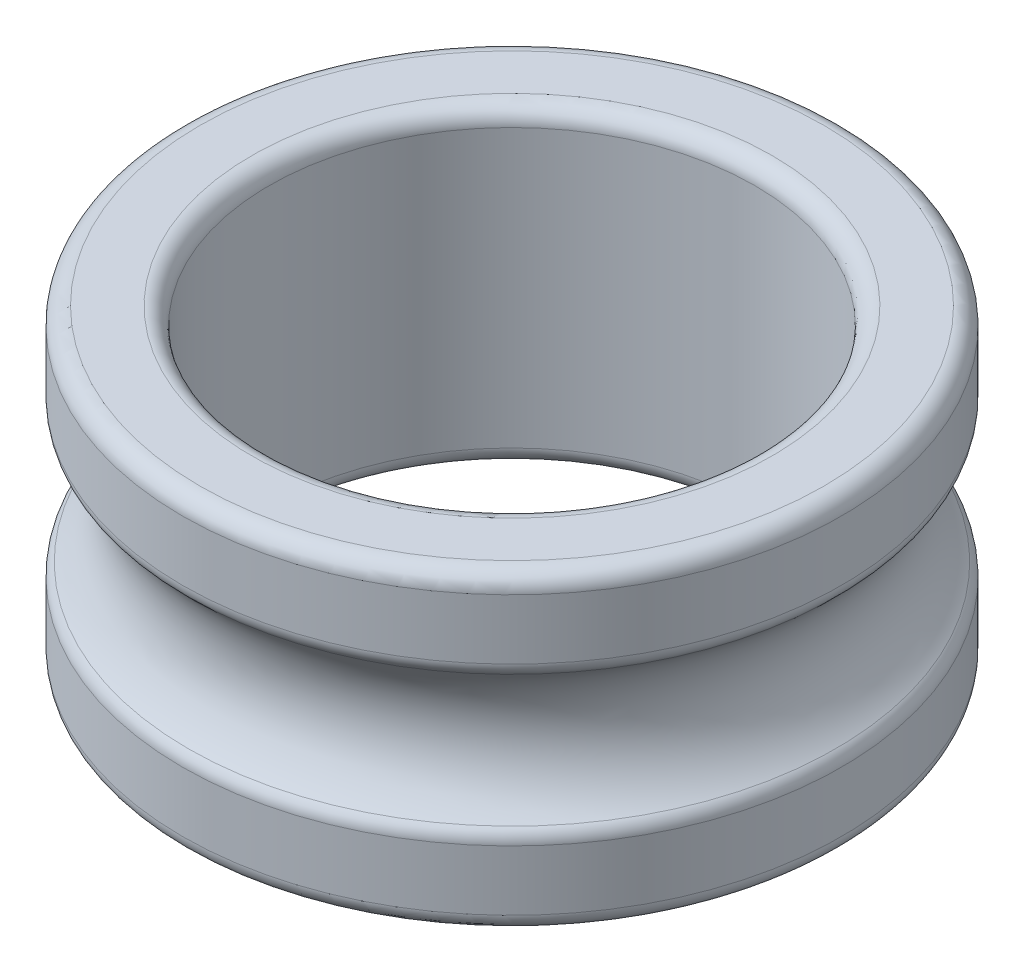
ISO-10303-21;
HEADER;
FILE_DESCRIPTION(('STEP AP214'),'2;1');
FILE_NAME('part.step','',(''),(''),'','','');
FILE_SCHEMA(('AUTOMOTIVE_DESIGN { 1 0 10303 214 1 1 1 1 }'));
ENDSEC;
DATA;
#1=APPLICATION_CONTEXT('core data for automotive mechanical design processes');
#2=APPLICATION_PROTOCOL_DEFINITION('international standard','automotive_design',2000,#1);
#3=PRODUCT_CONTEXT('',#1,'mechanical');
#4=PRODUCT('Part','Part','',(#3));
#5=PRODUCT_RELATED_PRODUCT_CATEGORY('part','',(#4));
#6=PRODUCT_DEFINITION_FORMATION('','',#4);
#7=PRODUCT_DEFINITION_CONTEXT('part definition',#1,'design');
#8=PRODUCT_DEFINITION('design','',#6,#7);
#9=PRODUCT_DEFINITION_SHAPE('','',#8);
#10=(LENGTH_UNIT() NAMED_UNIT(*) SI_UNIT(.MILLI.,.METRE.));
#11=(NAMED_UNIT(*) PLANE_ANGLE_UNIT() SI_UNIT($,.RADIAN.));
#12=(NAMED_UNIT(*) SI_UNIT($,.STERADIAN.) SOLID_ANGLE_UNIT());
#13=UNCERTAINTY_MEASURE_WITH_UNIT(LENGTH_MEASURE(1.E-05),#10,'distance_accuracy_value','');
#14=(GEOMETRIC_REPRESENTATION_CONTEXT(3) GLOBAL_UNCERTAINTY_ASSIGNED_CONTEXT((#13)) GLOBAL_UNIT_ASSIGNED_CONTEXT((#10,
#11,#12)) REPRESENTATION_CONTEXT('',''));
#15=CARTESIAN_POINT('',(0.,0.,0.));
#16=DIRECTION('',(0.,0.,1.));
#17=DIRECTION('',(1.,0.,0.));
#18=AXIS2_PLACEMENT_3D('',#15,#16,#17);
#19=CARTESIAN_POINT('',(0.,-1.21039938313901,0.));
#20=DIRECTION('',(0.,-1.,0.));
#21=DIRECTION('',(0.,0.,-1.));
#22=AXIS2_PLACEMENT_3D('',#19,#20,#21);
#23=TOROIDAL_SURFACE('',#22,4.80000000006,0.26666666667);
#24=CARTESIAN_POINT('',(0.,-1.01033336939702,0.));
#25=DIRECTION('',(0.,-1.,0.));
#26=DIRECTION('',(0.,0.,-1.));
#27=AXIS2_PLACEMENT_3D('',#24,#25,#26);
#28=CIRCLE('',#27,4.97630854000711);
#29=CARTESIAN_POINT('',(0.,-1.01033336939702,-4.97630854000711));
#30=VERTEX_POINT('',#29);
#31=EDGE_CURVE('E87',#30,#30,#28,.T.);
#32=ORIENTED_EDGE('',*,*,#31,.T.);
#33=EDGE_LOOP('',(#32));
#34=FACE_BOUND('',#33,.T.);
#35=CARTESIAN_POINT('',(0.,-1.21039938313901,0.));
#36=DIRECTION('',(0.,-1.,0.));
#37=DIRECTION('',(0.,0.,-1.));
#38=AXIS2_PLACEMENT_3D('',#35,#36,#37);
#39=CIRCLE('',#38,5.06666666673);
#40=CARTESIAN_POINT('',(0.,-1.21039938313901,-5.06666666673));
#41=VERTEX_POINT('',#40);
#42=EDGE_CURVE('E10',#41,#41,#39,.T.);
#43=ORIENTED_EDGE('',*,*,#42,.F.);
#44=EDGE_LOOP('',(#43));
#45=FACE_BOUND('',#44,.T.);
#46=ADVANCED_FACE('F36',(#34,#45),#23,.T.);
#47=CARTESIAN_POINT('',(0.,-2.61620644353915,0.));
#48=DIRECTION('',(0.,-1.,0.));
#49=DIRECTION('',(0.,0.,-1.));
#50=AXIS2_PLACEMENT_3D('',#47,#48,#49);
#51=CYLINDRICAL_SURFACE('',#50,5.06666666673);
#52=ORIENTED_EDGE('',*,*,#42,.T.);
#53=EDGE_LOOP('',(#52));
#54=FACE_BOUND('',#53,.T.);
#55=CARTESIAN_POINT('',(0.,-2.13333333336,0.));
#56=DIRECTION('',(0.,-1.,0.));
#57=DIRECTION('',(0.,0.,-1.));
#58=AXIS2_PLACEMENT_3D('',#55,#56,#57);
#59=CIRCLE('',#58,5.06666666673);
#60=CARTESIAN_POINT('',(0.,-2.13333333336,-5.06666666673));
#61=VERTEX_POINT('',#60);
#62=EDGE_CURVE('E43',#61,#61,#59,.T.);
#63=ORIENTED_EDGE('',*,*,#62,.F.);
#64=EDGE_LOOP('',(#63));
#65=FACE_BOUND('',#64,.T.);
#66=ADVANCED_FACE('F106',(#54,#65),#51,.T.);
#67=CARTESIAN_POINT('',(0.,-2.13333333336,0.));
#68=DIRECTION('',(0.,-1.,0.));
#69=DIRECTION('',(0.,0.,-1.));
#70=AXIS2_PLACEMENT_3D('',#67,#68,#69);
#71=TOROIDAL_SURFACE('',#70,4.80000000006,0.26666666667);
#72=ORIENTED_EDGE('',*,*,#62,.T.);
#73=EDGE_LOOP('',(#72));
#74=FACE_BOUND('',#73,.T.);
#75=CARTESIAN_POINT('',(0.,-2.40000000003,0.));
#76=DIRECTION('',(0.,-1.,0.));
#77=DIRECTION('',(0.,0.,-1.));
#78=AXIS2_PLACEMENT_3D('',#75,#76,#77);
#79=CIRCLE('',#78,4.80000000006);
#80=CARTESIAN_POINT('',(0.,-2.40000000003,-4.80000000006));
#81=VERTEX_POINT('',#80);
#82=EDGE_CURVE('E48',#81,#81,#79,.T.);
#83=ORIENTED_EDGE('',*,*,#82,.F.);
#84=EDGE_LOOP('',(#83));
#85=FACE_BOUND('',#84,.T.);
#86=ADVANCED_FACE('F110',(#74,#85),#71,.T.);
#87=CARTESIAN_POINT('',(0.,-2.40000000003,-4.00000000005));
#88=DIRECTION('',(0.,-1.,0.));
#89=DIRECTION('',(0.,0.,-1.));
#90=AXIS2_PLACEMENT_3D('',#87,#88,#89);
#91=PLANE('',#90);
#92=ORIENTED_EDGE('',*,*,#82,.T.);
#93=EDGE_LOOP('',(#92));
#94=FACE_BOUND('',#93,.T.);
#95=CARTESIAN_POINT('',(0.,-2.40000000003,0.));
#96=DIRECTION('',(0.,-1.,0.));
#97=DIRECTION('',(0.,0.,-1.));
#98=AXIS2_PLACEMENT_3D('',#95,#96,#97);
#99=CIRCLE('',#98,4.00000000005);
#100=CARTESIAN_POINT('',(0.,-2.40000000003,-4.00000000005));
#101=VERTEX_POINT('',#100);
#102=EDGE_CURVE('E53',#101,#101,#99,.T.);
#103=ORIENTED_EDGE('',*,*,#102,.F.);
#104=EDGE_LOOP('',(#103));
#105=FACE_BOUND('',#104,.T.);
#106=ADVANCED_FACE('F114',(#94,#105),#91,.T.);
#107=CARTESIAN_POINT('',(0.,-2.13333333336,0.));
#108=DIRECTION('',(0.,-1.,0.));
#109=DIRECTION('',(0.,0.,-1.));
#110=AXIS2_PLACEMENT_3D('',#107,#108,#109);
#111=TOROIDAL_SURFACE('',#110,4.00000000005,0.26666666667);
#112=ORIENTED_EDGE('',*,*,#102,.T.);
#113=EDGE_LOOP('',(#112));
#114=FACE_BOUND('',#113,.T.);
#115=CARTESIAN_POINT('',(0.,-2.13333333336,0.));
#116=DIRECTION('',(0.,-1.,0.));
#117=DIRECTION('',(0.,0.,-1.));
#118=AXIS2_PLACEMENT_3D('',#115,#116,#117);
#119=CIRCLE('',#118,3.73333333338);
#120=CARTESIAN_POINT('',(0.,-2.13333333336,-3.73333333338));
#121=VERTEX_POINT('',#120);
#122=EDGE_CURVE('E59',#121,#121,#119,.T.);
#123=ORIENTED_EDGE('',*,*,#122,.F.);
#124=EDGE_LOOP('',(#123));
#125=FACE_BOUND('',#124,.T.);
#126=ADVANCED_FACE('F120',(#114,#125),#111,.T.);
#127=CARTESIAN_POINT('',(0.,-2.61620644353915,0.));
#128=DIRECTION('',(0.,-1.,0.));
#129=DIRECTION('',(0.,0.,-1.));
#130=AXIS2_PLACEMENT_3D('',#127,#128,#129);
#131=CYLINDRICAL_SURFACE('',#130,3.73333333338);
#132=ORIENTED_EDGE('',*,*,#122,.T.);
#133=EDGE_LOOP('',(#132));
#134=FACE_BOUND('',#133,.T.);
#135=CARTESIAN_POINT('',(0.,2.13333333336,0.));
#136=DIRECTION('',(0.,-1.,0.));
#137=DIRECTION('',(0.,0.,-1.));
#138=AXIS2_PLACEMENT_3D('',#135,#136,#137);
#139=CIRCLE('',#138,3.73333333338);
#140=CARTESIAN_POINT('',(0.,2.13333333336,-3.73333333338));
#141=VERTEX_POINT('',#140);
#142=EDGE_CURVE('E63',#141,#141,#139,.T.);
#143=ORIENTED_EDGE('',*,*,#142,.F.);
#144=EDGE_LOOP('',(#143));
#145=FACE_BOUND('',#144,.T.);
#146=ADVANCED_FACE('F124',(#134,#145),#131,.F.);
#147=CARTESIAN_POINT('',(0.,2.13333333336,0.));
#148=DIRECTION('',(0.,-1.,0.));
#149=DIRECTION('',(0.,0.,-1.));
#150=AXIS2_PLACEMENT_3D('',#147,#148,#149);
#151=TOROIDAL_SURFACE('',#150,4.00000000005,0.26666666667);
#152=ORIENTED_EDGE('',*,*,#142,.T.);
#153=EDGE_LOOP('',(#152));
#154=FACE_BOUND('',#153,.T.);
#155=CARTESIAN_POINT('',(0.,2.40000000003,0.));
#156=DIRECTION('',(0.,-1.,0.));
#157=DIRECTION('',(0.,0.,-1.));
#158=AXIS2_PLACEMENT_3D('',#155,#156,#157);
#159=CIRCLE('',#158,4.00000000005);
#160=CARTESIAN_POINT('',(0.,2.40000000003,-4.00000000005));
#161=VERTEX_POINT('',#160);
#162=EDGE_CURVE('E67',#161,#161,#159,.T.);
#163=ORIENTED_EDGE('',*,*,#162,.F.);
#164=EDGE_LOOP('',(#163));
#165=FACE_BOUND('',#164,.T.);
#166=ADVANCED_FACE('F128',(#154,#165),#151,.T.);
#167=CARTESIAN_POINT('',(0.,2.40000000003,-4.80000000006));
#168=DIRECTION('',(0.,1.,0.));
#169=DIRECTION('',(0.,0.,1.));
#170=AXIS2_PLACEMENT_3D('',#167,#168,#169);
#171=PLANE('',#170);
#172=ORIENTED_EDGE('',*,*,#162,.T.);
#173=EDGE_LOOP('',(#172));
#174=FACE_BOUND('',#173,.T.);
#175=CARTESIAN_POINT('',(0.,2.40000000003,0.));
#176=DIRECTION('',(0.,-1.,0.));
#177=DIRECTION('',(0.,0.,-1.));
#178=AXIS2_PLACEMENT_3D('',#175,#176,#177);
#179=CIRCLE('',#178,4.80000000006);
#180=CARTESIAN_POINT('',(0.,2.40000000003,-4.80000000006));
#181=VERTEX_POINT('',#180);
#182=EDGE_CURVE('E71',#181,#181,#179,.T.);
#183=ORIENTED_EDGE('',*,*,#182,.F.);
#184=EDGE_LOOP('',(#183));
#185=FACE_BOUND('',#184,.T.);
#186=ADVANCED_FACE('F132',(#174,#185),#171,.T.);
#187=CARTESIAN_POINT('',(0.,2.13333333336,0.));
#188=DIRECTION('',(0.,-1.,0.));
#189=DIRECTION('',(0.,0.,-1.));
#190=AXIS2_PLACEMENT_3D('',#187,#188,#189);
#191=TOROIDAL_SURFACE('',#190,4.80000000006,0.26666666667);
#192=ORIENTED_EDGE('',*,*,#182,.T.);
#193=EDGE_LOOP('',(#192));
#194=FACE_BOUND('',#193,.T.);
#195=CARTESIAN_POINT('',(0.,2.13333333336,0.));
#196=DIRECTION('',(0.,-1.,0.));
#197=DIRECTION('',(0.,0.,-1.));
#198=AXIS2_PLACEMENT_3D('',#195,#196,#197);
#199=CIRCLE('',#198,5.06666666673);
#200=CARTESIAN_POINT('',(0.,2.13333333336,-5.06666666673));
#201=VERTEX_POINT('',#200);
#202=EDGE_CURVE('E75',#201,#201,#199,.T.);
#203=ORIENTED_EDGE('',*,*,#202,.F.);
#204=EDGE_LOOP('',(#203));
#205=FACE_BOUND('',#204,.T.);
#206=ADVANCED_FACE('F136',(#194,#205),#191,.T.);
#207=CARTESIAN_POINT('',(0.,-2.61620644353915,0.));
#208=DIRECTION('',(0.,-1.,0.));
#209=DIRECTION('',(0.,0.,-1.));
#210=AXIS2_PLACEMENT_3D('',#207,#208,#209);
#211=CYLINDRICAL_SURFACE('',#210,5.06666666673);
#212=ORIENTED_EDGE('',*,*,#202,.T.);
#213=EDGE_LOOP('',(#212));
#214=FACE_BOUND('',#213,.T.);
#215=CARTESIAN_POINT('',(0.,1.21039938313901,0.));
#216=DIRECTION('',(0.,-1.,0.));
#217=DIRECTION('',(0.,0.,-1.));
#218=AXIS2_PLACEMENT_3D('',#215,#216,#217);
#219=CIRCLE('',#218,5.06666666673);
#220=CARTESIAN_POINT('',(0.,1.21039938313901,-5.06666666673));
#221=VERTEX_POINT('',#220);
#222=EDGE_CURVE('E79',#221,#221,#219,.T.);
#223=ORIENTED_EDGE('',*,*,#222,.F.);
#224=EDGE_LOOP('',(#223));
#225=FACE_BOUND('',#224,.T.);
#226=ADVANCED_FACE('F102',(#214,#225),#211,.T.);
#227=CARTESIAN_POINT('',(0.,1.21039938313901,0.));
#228=DIRECTION('',(0.,-1.,0.));
#229=DIRECTION('',(0.,0.,-1.));
#230=AXIS2_PLACEMENT_3D('',#227,#228,#229);
#231=TOROIDAL_SURFACE('',#230,4.80000000006,0.26666666667);
#232=ORIENTED_EDGE('',*,*,#222,.T.);
#233=EDGE_LOOP('',(#232));
#234=FACE_BOUND('',#233,.T.);
#235=CARTESIAN_POINT('',(0.,1.01033336939702,0.));
#236=DIRECTION('',(0.,-1.,0.));
#237=DIRECTION('',(0.,0.,-1.));
#238=AXIS2_PLACEMENT_3D('',#235,#236,#237);
#239=CIRCLE('',#238,4.97630854000711);
#240=CARTESIAN_POINT('',(0.,1.01033336939702,-4.97630854000711));
#241=VERTEX_POINT('',#240);
#242=EDGE_CURVE('E83',#241,#241,#239,.T.);
#243=ORIENTED_EDGE('',*,*,#242,.F.);
#244=EDGE_LOOP('',(#243));
#245=FACE_BOUND('',#244,.T.);
#246=ADVANCED_FACE('F96',(#234,#245),#231,.T.);
#247=CARTESIAN_POINT('',(0.,0.,0.));
#248=DIRECTION('',(0.,-1.,0.));
#249=DIRECTION('',(0.,0.,-1.));
#250=AXIS2_PLACEMENT_3D('',#247,#248,#249);
#251=TOROIDAL_SURFACE('',#250,5.86666666674,1.3466666666835);
#252=ORIENTED_EDGE('',*,*,#242,.T.);
#253=EDGE_LOOP('',(#252));
#254=FACE_BOUND('',#253,.T.);
#255=ORIENTED_EDGE('',*,*,#31,.F.);
#256=EDGE_LOOP('',(#255));
#257=FACE_BOUND('',#256,.T.);
#258=ADVANCED_FACE('F94',(#254,#257),#251,.F.);
#259=CLOSED_SHELL('',(#46,#66,#86,#106,#126,#146,#166,#186,#206,#226,#246,#258));
#260=MANIFOLD_SOLID_BREP('B2',#259);
#261=ADVANCED_BREP_SHAPE_REPRESENTATION('',(#18,#260),#14);
#262=SHAPE_DEFINITION_REPRESENTATION(#9,#261);
ENDSEC;
END-ISO-10303-21;
